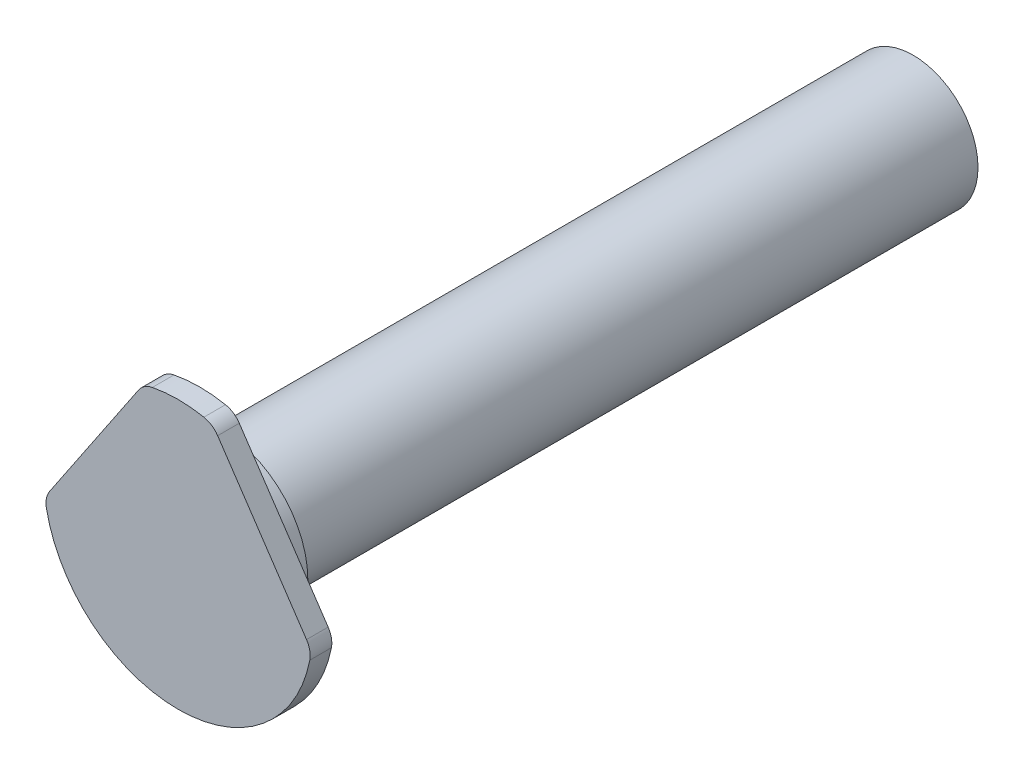
ISO-10303-21;
HEADER;
FILE_DESCRIPTION(('STEP AP214'),'2;1');
FILE_NAME('part.step','',(''),(''),'','','');
FILE_SCHEMA(('AUTOMOTIVE_DESIGN { 1 0 10303 214 1 1 1 1 }'));
ENDSEC;
DATA;
#1=APPLICATION_CONTEXT('core data for automotive mechanical design processes');
#2=APPLICATION_PROTOCOL_DEFINITION('international standard','automotive_design',2000,#1);
#3=PRODUCT_CONTEXT('',#1,'mechanical');
#4=PRODUCT('Part','Part','',(#3));
#5=PRODUCT_RELATED_PRODUCT_CATEGORY('part','',(#4));
#6=PRODUCT_DEFINITION_FORMATION('','',#4);
#7=PRODUCT_DEFINITION_CONTEXT('part definition',#1,'design');
#8=PRODUCT_DEFINITION('design','',#6,#7);
#9=PRODUCT_DEFINITION_SHAPE('','',#8);
#10=(LENGTH_UNIT() NAMED_UNIT(*) SI_UNIT(.MILLI.,.METRE.));
#11=(NAMED_UNIT(*) PLANE_ANGLE_UNIT() SI_UNIT($,.RADIAN.));
#12=(NAMED_UNIT(*) SI_UNIT($,.STERADIAN.) SOLID_ANGLE_UNIT());
#13=UNCERTAINTY_MEASURE_WITH_UNIT(LENGTH_MEASURE(1.E-05),#10,'distance_accuracy_value','');
#14=(GEOMETRIC_REPRESENTATION_CONTEXT(3) GLOBAL_UNCERTAINTY_ASSIGNED_CONTEXT((#13)) GLOBAL_UNIT_ASSIGNED_CONTEXT((#10,
#11,#12)) REPRESENTATION_CONTEXT('',''));
#15=CARTESIAN_POINT('',(0.,0.,0.));
#16=DIRECTION('',(0.,0.,1.));
#17=DIRECTION('',(1.,0.,0.));
#18=AXIS2_PLACEMENT_3D('',#15,#16,#17);
#19=CARTESIAN_POINT('',(0.,0.,-16.));
#20=DIRECTION('',(0.,0.,1.));
#21=DIRECTION('',(1.,0.,0.));
#22=AXIS2_PLACEMENT_3D('',#19,#20,#21);
#23=CYLINDRICAL_SURFACE('',#22,1.5);
#24=CARTESIAN_POINT('',(0.,0.,-16.));
#25=DIRECTION('',(0.,0.,1.));
#26=DIRECTION('',(1.,0.,0.));
#27=AXIS2_PLACEMENT_3D('',#24,#25,#26);
#28=CIRCLE('',#27,1.5);
#29=CARTESIAN_POINT('',(1.5,0.,-16.));
#30=VERTEX_POINT('',#29);
#31=EDGE_CURVE('E11',#30,#30,#28,.T.);
#32=ORIENTED_EDGE('',*,*,#31,.T.);
#33=EDGE_LOOP('',(#32));
#34=FACE_BOUND('',#33,.T.);
#35=CARTESIAN_POINT('',(0.,0.,0.));
#36=DIRECTION('',(0.,0.,1.));
#37=DIRECTION('',(1.,0.,0.));
#38=AXIS2_PLACEMENT_3D('',#35,#36,#37);
#39=CIRCLE('',#38,1.5);
#40=CARTESIAN_POINT('',(1.5,0.,0.));
#41=VERTEX_POINT('',#40);
#42=EDGE_CURVE('E37',#41,#41,#39,.T.);
#43=ORIENTED_EDGE('',*,*,#42,.F.);
#44=EDGE_LOOP('',(#43));
#45=FACE_BOUND('',#44,.T.);
#46=ADVANCED_FACE('F34',(#34,#45),#23,.T.);
#47=CARTESIAN_POINT('',(0.,0.,-16.));
#48=DIRECTION('',(0.,0.,1.));
#49=DIRECTION('',(1.,0.,0.));
#50=AXIS2_PLACEMENT_3D('',#47,#48,#49);
#51=PLANE('',#50);
#52=ORIENTED_EDGE('',*,*,#31,.F.);
#53=EDGE_LOOP('',(#52));
#54=FACE_BOUND('',#53,.T.);
#55=ADVANCED_FACE('F179',(#54),#51,.F.);
#56=CARTESIAN_POINT('',(0.,0.,0.5));
#57=DIRECTION('',(0.,0.,-1.));
#58=DIRECTION('',(-1.,0.,0.));
#59=AXIS2_PLACEMENT_3D('',#56,#57,#58);
#60=CYLINDRICAL_SURFACE('',#59,2.);
#61=CARTESIAN_POINT('',(0.,0.,0.5));
#62=DIRECTION('',(0.,0.,1.));
#63=DIRECTION('',(1.,0.,0.));
#64=AXIS2_PLACEMENT_3D('',#61,#62,#63);
#65=CIRCLE('',#64,2.);
#66=CARTESIAN_POINT('',(2.,0.,0.5));
#67=VERTEX_POINT('',#66);
#68=EDGE_CURVE('E160',#67,#67,#65,.T.);
#69=ORIENTED_EDGE('',*,*,#68,.F.);
#70=EDGE_LOOP('',(#69));
#71=FACE_BOUND('',#70,.T.);
#72=CARTESIAN_POINT('',(0.,0.,0.));
#73=DIRECTION('',(0.,0.,1.));
#74=DIRECTION('',(1.,0.,0.));
#75=AXIS2_PLACEMENT_3D('',#72,#73,#74);
#76=CIRCLE('',#75,2.);
#77=CARTESIAN_POINT('',(2.,0.,0.));
#78=VERTEX_POINT('',#77);
#79=EDGE_CURVE('E159',#78,#78,#76,.T.);
#80=ORIENTED_EDGE('',*,*,#79,.T.);
#81=EDGE_LOOP('',(#80));
#82=FACE_BOUND('',#81,.T.);
#83=ADVANCED_FACE('F166',(#71,#82),#60,.T.);
#84=CARTESIAN_POINT('',(0.,0.,0.));
#85=DIRECTION('',(0.,0.,1.));
#86=DIRECTION('',(1.,0.,0.));
#87=AXIS2_PLACEMENT_3D('',#84,#85,#86);
#88=PLANE('',#87);
#89=ORIENTED_EDGE('',*,*,#42,.T.);
#90=EDGE_LOOP('',(#89));
#91=FACE_BOUND('',#90,.T.);
#92=ORIENTED_EDGE('',*,*,#79,.F.);
#93=EDGE_LOOP('',(#92));
#94=FACE_BOUND('',#93,.T.);
#95=ADVANCED_FACE('F168',(#91,#94),#88,.F.);
#96=CARTESIAN_POINT('',(1.94258746317002,1.30680927119655,1.));
#97=DIRECTION('',(0.82972652044211,0.558170136495162,0.));
#98=DIRECTION('',(-0.558170136495162,0.82972652044211,0.));
#99=AXIS2_PLACEMENT_3D('',#96,#97,#98);
#100=PLANE('',#99);
#101=DIRECTION('',(0.558170136495162,-0.82972652044211,0.));
#102=VECTOR('',#101,1.);
#103=CARTESIAN_POINT('',(1.94258746317002,1.30680927119655,0.5));
#104=LINE('',#103,#102);
#105=CARTESIAN_POINT('',(0.914863260221055,2.83453347414552,0.5));
#106=VERTEX_POINT('',#105);
#107=CARTESIAN_POINT('',(2.97031166611899,-0.220914931752419,0.5));
#108=VERTEX_POINT('',#107);
#109=EDGE_CURVE('E130',#106,#108,#104,.T.);
#110=ORIENTED_EDGE('',*,*,#109,.F.);
#111=DIRECTION('',(0.,0.,-1.));
#112=VECTOR('',#111,1.);
#113=CARTESIAN_POINT('',(0.914863260221055,2.83453347414552,1.));
#114=LINE('',#113,#112);
#115=CARTESIAN_POINT('',(0.914863260221055,2.83453347414552,1.));
#116=VERTEX_POINT('',#115);
#117=EDGE_CURVE('E91',#116,#106,#114,.T.);
#118=ORIENTED_EDGE('',*,*,#117,.F.);
#119=DIRECTION('',(0.558170136495162,-0.82972652044211,0.));
#120=VECTOR('',#119,1.);
#121=CARTESIAN_POINT('',(1.94258746317002,1.30680927119655,1.));
#122=LINE('',#121,#120);
#123=CARTESIAN_POINT('',(2.97031166611899,-0.220914931752419,1.));
#124=VERTEX_POINT('',#123);
#125=EDGE_CURVE('E147',#116,#124,#122,.T.);
#126=ORIENTED_EDGE('',*,*,#125,.T.);
#127=DIRECTION('',(0.,0.,-1.));
#128=VECTOR('',#127,1.);
#129=CARTESIAN_POINT('',(2.97031166611899,-0.220914931752419,1.));
#130=LINE('',#129,#128);
#131=EDGE_CURVE('E86',#124,#108,#130,.T.);
#132=ORIENTED_EDGE('',*,*,#131,.T.);
#133=EDGE_LOOP('',(#110,#118,#126,#132));
#134=FACE_BOUND('',#133,.T.);
#135=ADVANCED_FACE('F170',(#134),#100,.T.);
#136=CARTESIAN_POINT('',(0.5,2.55544840589794,1.));
#137=DIRECTION('',(0.,0.,-1.));
#138=DIRECTION('',(-1.,0.,0.));
#139=AXIS2_PLACEMENT_3D('',#136,#137,#138);
#140=CYLINDRICAL_SURFACE('',#139,0.5);
#141=CARTESIAN_POINT('',(0.5,2.55544840589794,0.5));
#142=DIRECTION('',(0.,0.,1.));
#143=DIRECTION('',(1.,0.,0.));
#144=AXIS2_PLACEMENT_3D('',#141,#142,#143);
#145=CIRCLE('',#144,0.5);
#146=CARTESIAN_POINT('',(0.596009680281692,3.04614397475118,0.5));
#147=VERTEX_POINT('',#146);
#148=EDGE_CURVE('E133',#106,#147,#145,.T.);
#149=ORIENTED_EDGE('',*,*,#148,.T.);
#150=DIRECTION('',(0.,0.,-1.));
#151=VECTOR('',#150,1.);
#152=CARTESIAN_POINT('',(0.596009680281692,3.04614397475118,1.));
#153=LINE('',#152,#151);
#154=CARTESIAN_POINT('',(0.596009680281692,3.04614397475118,1.));
#155=VERTEX_POINT('',#154);
#156=EDGE_CURVE('E155',#155,#147,#153,.T.);
#157=ORIENTED_EDGE('',*,*,#156,.F.);
#158=CARTESIAN_POINT('',(0.5,2.55544840589794,1.));
#159=DIRECTION('',(0.,0.,1.));
#160=DIRECTION('',(1.,0.,0.));
#161=AXIS2_PLACEMENT_3D('',#158,#159,#160);
#162=CIRCLE('',#161,0.5);
#163=EDGE_CURVE('E320',#116,#155,#162,.T.);
#164=ORIENTED_EDGE('',*,*,#163,.F.);
#165=ORIENTED_EDGE('',*,*,#117,.T.);
#166=EDGE_LOOP('',(#149,#157,#164,#165));
#167=FACE_BOUND('',#166,.T.);
#168=ADVANCED_FACE('F177',(#167),#140,.T.);
#169=CARTESIAN_POINT('',(0.,0.,1.));
#170=DIRECTION('',(0.,0.,-1.));
#171=DIRECTION('',(-1.,0.,0.));
#172=AXIS2_PLACEMENT_3D('',#169,#170,#171);
#173=CYLINDRICAL_SURFACE('',#172,3.10390409869609);
#174=CARTESIAN_POINT('',(0.,0.,0.5));
#175=DIRECTION('',(0.,0.,1.));
#176=DIRECTION('',(1.,0.,0.));
#177=AXIS2_PLACEMENT_3D('',#174,#175,#176);
#178=CIRCLE('',#177,3.10390409869609);
#179=CARTESIAN_POINT('',(-0.596009680281693,3.04614397475118,0.5));
#180=VERTEX_POINT('',#179);
#181=EDGE_CURVE('E135',#147,#180,#178,.T.);
#182=ORIENTED_EDGE('',*,*,#181,.T.);
#183=DIRECTION('',(0.,0.,-1.));
#184=VECTOR('',#183,1.);
#185=CARTESIAN_POINT('',(-0.596009680281693,3.04614397475118,1.));
#186=LINE('',#185,#184);
#187=CARTESIAN_POINT('',(-0.596009680281693,3.04614397475118,1.));
#188=VERTEX_POINT('',#187);
#189=EDGE_CURVE('E153',#188,#180,#186,.T.);
#190=ORIENTED_EDGE('',*,*,#189,.F.);
#191=CARTESIAN_POINT('',(0.,0.,1.));
#192=DIRECTION('',(0.,0.,1.));
#193=DIRECTION('',(1.,0.,0.));
#194=AXIS2_PLACEMENT_3D('',#191,#192,#193);
#195=CIRCLE('',#194,3.10390409869609);
#196=EDGE_CURVE('E317',#155,#188,#195,.T.);
#197=ORIENTED_EDGE('',*,*,#196,.F.);
#198=ORIENTED_EDGE('',*,*,#156,.T.);
#199=EDGE_LOOP('',(#182,#190,#197,#198));
#200=FACE_BOUND('',#199,.T.);
#201=ADVANCED_FACE('F217',(#200),#173,.T.);
#202=CARTESIAN_POINT('',(-0.5,2.55544840589794,1.));
#203=DIRECTION('',(0.,0.,-1.));
#204=DIRECTION('',(-1.,0.,0.));
#205=AXIS2_PLACEMENT_3D('',#202,#203,#204);
#206=CYLINDRICAL_SURFACE('',#205,0.5);
#207=CARTESIAN_POINT('',(-0.5,2.55544840589794,0.5));
#208=DIRECTION('',(0.,0.,1.));
#209=DIRECTION('',(1.,0.,0.));
#210=AXIS2_PLACEMENT_3D('',#207,#208,#209);
#211=CIRCLE('',#210,0.5);
#212=CARTESIAN_POINT('',(-0.914863260221055,2.83453347414552,0.5));
#213=VERTEX_POINT('',#212);
#214=EDGE_CURVE('E138',#213,#180,#211,.F.);
#215=ORIENTED_EDGE('',*,*,#214,.F.);
#216=DIRECTION('',(0.,0.,-1.));
#217=VECTOR('',#216,1.);
#218=CARTESIAN_POINT('',(-0.914863260221055,2.83453347414552,1.));
#219=LINE('',#218,#217);
#220=CARTESIAN_POINT('',(-0.914863260221055,2.83453347414552,1.));
#221=VERTEX_POINT('',#220);
#222=EDGE_CURVE('E151',#221,#213,#219,.T.);
#223=ORIENTED_EDGE('',*,*,#222,.F.);
#224=CARTESIAN_POINT('',(-0.5,2.55544840589794,1.));
#225=DIRECTION('',(0.,0.,1.));
#226=DIRECTION('',(1.,0.,0.));
#227=AXIS2_PLACEMENT_3D('',#224,#225,#226);
#228=CIRCLE('',#227,0.5);
#229=EDGE_CURVE('E319',#221,#188,#228,.F.);
#230=ORIENTED_EDGE('',*,*,#229,.T.);
#231=ORIENTED_EDGE('',*,*,#189,.T.);
#232=EDGE_LOOP('',(#215,#223,#230,#231));
#233=FACE_BOUND('',#232,.T.);
#234=ADVANCED_FACE('F227',(#233),#206,.T.);
#235=CARTESIAN_POINT('',(-1.94258746317002,1.30680927119655,1.));
#236=DIRECTION('',(0.82972652044211,-0.558170136495162,0.));
#237=DIRECTION('',(0.558170136495162,0.82972652044211,0.));
#238=AXIS2_PLACEMENT_3D('',#235,#236,#237);
#239=PLANE('',#238);
#240=DIRECTION('',(-0.558170136495162,-0.82972652044211,0.));
#241=VECTOR('',#240,1.);
#242=CARTESIAN_POINT('',(-1.94258746317002,1.30680927119655,0.5));
#243=LINE('',#242,#241);
#244=CARTESIAN_POINT('',(-2.97031166611899,-0.220914931752419,0.5));
#245=VERTEX_POINT('',#244);
#246=EDGE_CURVE('E141',#213,#245,#243,.T.);
#247=ORIENTED_EDGE('',*,*,#246,.T.);
#248=DIRECTION('',(0.,0.,-1.));
#249=VECTOR('',#248,1.);
#250=CARTESIAN_POINT('',(-2.97031166611899,-0.220914931752419,1.));
#251=LINE('',#250,#249);
#252=CARTESIAN_POINT('',(-2.97031166611899,-0.220914931752419,1.));
#253=VERTEX_POINT('',#252);
#254=EDGE_CURVE('E122',#253,#245,#251,.T.);
#255=ORIENTED_EDGE('',*,*,#254,.F.);
#256=DIRECTION('',(-0.558170136495162,-0.82972652044211,0.));
#257=VECTOR('',#256,1.);
#258=CARTESIAN_POINT('',(-1.94258746317002,1.30680927119655,1.));
#259=LINE('',#258,#257);
#260=EDGE_CURVE('E113',#221,#253,#259,.T.);
#261=ORIENTED_EDGE('',*,*,#260,.F.);
#262=ORIENTED_EDGE('',*,*,#222,.T.);
#263=EDGE_LOOP('',(#247,#255,#261,#262));
#264=FACE_BOUND('',#263,.T.);
#265=ADVANCED_FACE('F237',(#264),#239,.F.);
#266=CARTESIAN_POINT('',(-2.55544840589794,-0.5,1.));
#267=DIRECTION('',(0.,0.,-1.));
#268=DIRECTION('',(-1.,0.,0.));
#269=AXIS2_PLACEMENT_3D('',#266,#267,#268);
#270=CYLINDRICAL_SURFACE('',#269,0.5);
#271=CARTESIAN_POINT('',(-2.55544840589794,-0.5,0.5));
#272=DIRECTION('',(0.,0.,1.));
#273=DIRECTION('',(1.,0.,0.));
#274=AXIS2_PLACEMENT_3D('',#271,#272,#273);
#275=CIRCLE('',#274,0.5);
#276=CARTESIAN_POINT('',(-3.04614397475118,-0.596009680281691,0.5));
#277=VERTEX_POINT('',#276);
#278=EDGE_CURVE('E121',#245,#277,#275,.T.);
#279=ORIENTED_EDGE('',*,*,#278,.T.);
#280=DIRECTION('',(0.,0.,-1.));
#281=VECTOR('',#280,1.);
#282=CARTESIAN_POINT('',(-3.04614397475118,-0.596009680281691,1.));
#283=LINE('',#282,#281);
#284=CARTESIAN_POINT('',(-3.04614397475118,-0.596009680281691,1.));
#285=VERTEX_POINT('',#284);
#286=EDGE_CURVE('E118',#285,#277,#283,.T.);
#287=ORIENTED_EDGE('',*,*,#286,.F.);
#288=CARTESIAN_POINT('',(-2.55544840589794,-0.5,1.));
#289=DIRECTION('',(0.,0.,1.));
#290=DIRECTION('',(1.,0.,0.));
#291=AXIS2_PLACEMENT_3D('',#288,#289,#290);
#292=CIRCLE('',#291,0.5);
#293=EDGE_CURVE('E106',#253,#285,#292,.T.);
#294=ORIENTED_EDGE('',*,*,#293,.F.);
#295=ORIENTED_EDGE('',*,*,#254,.T.);
#296=EDGE_LOOP('',(#279,#287,#294,#295));
#297=FACE_BOUND('',#296,.T.);
#298=ADVANCED_FACE('F119',(#297),#270,.T.);
#299=CARTESIAN_POINT('',(0.,0.,1.));
#300=DIRECTION('',(0.,0.,-1.));
#301=DIRECTION('',(-1.,0.,0.));
#302=AXIS2_PLACEMENT_3D('',#299,#300,#301);
#303=CYLINDRICAL_SURFACE('',#302,3.10390409869609);
#304=CARTESIAN_POINT('',(0.,0.,0.5));
#305=DIRECTION('',(0.,0.,1.));
#306=DIRECTION('',(1.,0.,0.));
#307=AXIS2_PLACEMENT_3D('',#304,#305,#306);
#308=CIRCLE('',#307,3.10390409869609);
#309=CARTESIAN_POINT('',(3.04614397475118,-0.596009680281694,0.5));
#310=VERTEX_POINT('',#309);
#311=EDGE_CURVE('E79',#277,#310,#308,.T.);
#312=ORIENTED_EDGE('',*,*,#311,.T.);
#313=DIRECTION('',(0.,0.,-1.));
#314=VECTOR('',#313,1.);
#315=CARTESIAN_POINT('',(3.04614397475118,-0.596009680281694,1.));
#316=LINE('',#315,#314);
#317=CARTESIAN_POINT('',(3.04614397475118,-0.596009680281694,1.));
#318=VERTEX_POINT('',#317);
#319=EDGE_CURVE('E123',#318,#310,#316,.T.);
#320=ORIENTED_EDGE('',*,*,#319,.F.);
#321=CARTESIAN_POINT('',(0.,0.,1.));
#322=DIRECTION('',(0.,0.,1.));
#323=DIRECTION('',(1.,0.,0.));
#324=AXIS2_PLACEMENT_3D('',#321,#322,#323);
#325=CIRCLE('',#324,3.10390409869609);
#326=EDGE_CURVE('E110',#285,#318,#325,.T.);
#327=ORIENTED_EDGE('',*,*,#326,.F.);
#328=ORIENTED_EDGE('',*,*,#286,.T.);
#329=EDGE_LOOP('',(#312,#320,#327,#328));
#330=FACE_BOUND('',#329,.T.);
#331=ADVANCED_FACE('F125',(#330),#303,.T.);
#332=CARTESIAN_POINT('',(2.55544840589794,-0.5,1.));
#333=DIRECTION('',(0.,0.,-1.));
#334=DIRECTION('',(-1.,0.,0.));
#335=AXIS2_PLACEMENT_3D('',#332,#333,#334);
#336=CYLINDRICAL_SURFACE('',#335,0.5);
#337=CARTESIAN_POINT('',(2.55544840589794,-0.5,0.5));
#338=DIRECTION('',(0.,0.,1.));
#339=DIRECTION('',(1.,0.,0.));
#340=AXIS2_PLACEMENT_3D('',#337,#338,#339);
#341=CIRCLE('',#340,0.5);
#342=EDGE_CURVE('E145',#310,#108,#341,.T.);
#343=ORIENTED_EDGE('',*,*,#342,.T.);
#344=ORIENTED_EDGE('',*,*,#131,.F.);
#345=CARTESIAN_POINT('',(2.55544840589794,-0.5,1.));
#346=DIRECTION('',(0.,0.,1.));
#347=DIRECTION('',(1.,0.,0.));
#348=AXIS2_PLACEMENT_3D('',#345,#346,#347);
#349=CIRCLE('',#348,0.5);
#350=EDGE_CURVE('E50',#318,#124,#349,.T.);
#351=ORIENTED_EDGE('',*,*,#350,.F.);
#352=ORIENTED_EDGE('',*,*,#319,.T.);
#353=EDGE_LOOP('',(#343,#344,#351,#352));
#354=FACE_BOUND('',#353,.T.);
#355=ADVANCED_FACE('F264',(#354),#336,.T.);
#356=CARTESIAN_POINT('',(0.,0.,1.));
#357=DIRECTION('',(0.,0.,1.));
#358=DIRECTION('',(1.,0.,0.));
#359=AXIS2_PLACEMENT_3D('',#356,#357,#358);
#360=PLANE('',#359);
#361=ORIENTED_EDGE('',*,*,#125,.F.);
#362=ORIENTED_EDGE('',*,*,#163,.T.);
#363=ORIENTED_EDGE('',*,*,#196,.T.);
#364=ORIENTED_EDGE('',*,*,#229,.F.);
#365=ORIENTED_EDGE('',*,*,#260,.T.);
#366=ORIENTED_EDGE('',*,*,#293,.T.);
#367=ORIENTED_EDGE('',*,*,#326,.T.);
#368=ORIENTED_EDGE('',*,*,#350,.T.);
#369=EDGE_LOOP('',(#361,#362,#363,#364,#365,#366,#367,#368));
#370=FACE_BOUND('',#369,.T.);
#371=ADVANCED_FACE('F108',(#370),#360,.T.);
#372=CARTESIAN_POINT('',(0.,0.,0.5));
#373=DIRECTION('',(0.,0.,1.));
#374=DIRECTION('',(1.,0.,0.));
#375=AXIS2_PLACEMENT_3D('',#372,#373,#374);
#376=PLANE('',#375);
#377=ORIENTED_EDGE('',*,*,#68,.T.);
#378=EDGE_LOOP('',(#377));
#379=FACE_BOUND('',#378,.T.);
#380=ORIENTED_EDGE('',*,*,#109,.T.);
#381=ORIENTED_EDGE('',*,*,#342,.F.);
#382=ORIENTED_EDGE('',*,*,#311,.F.);
#383=ORIENTED_EDGE('',*,*,#278,.F.);
#384=ORIENTED_EDGE('',*,*,#246,.F.);
#385=ORIENTED_EDGE('',*,*,#214,.T.);
#386=ORIENTED_EDGE('',*,*,#181,.F.);
#387=ORIENTED_EDGE('',*,*,#148,.F.);
#388=EDGE_LOOP('',(#380,#381,#382,#383,#384,#385,#386,#387));
#389=FACE_BOUND('',#388,.T.);
#390=ADVANCED_FACE('F283',(#379,#389),#376,.F.);
#391=CLOSED_SHELL('',(#46,#55,#83,#95,#135,#168,#201,#234,#265,#298,#331,#355,#371,#390));
#392=MANIFOLD_SOLID_BREP('B2',#391);
#393=ADVANCED_BREP_SHAPE_REPRESENTATION('',(#18,#392),#14);
#394=SHAPE_DEFINITION_REPRESENTATION(#9,#393);
ENDSEC;
END-ISO-10303-21;
